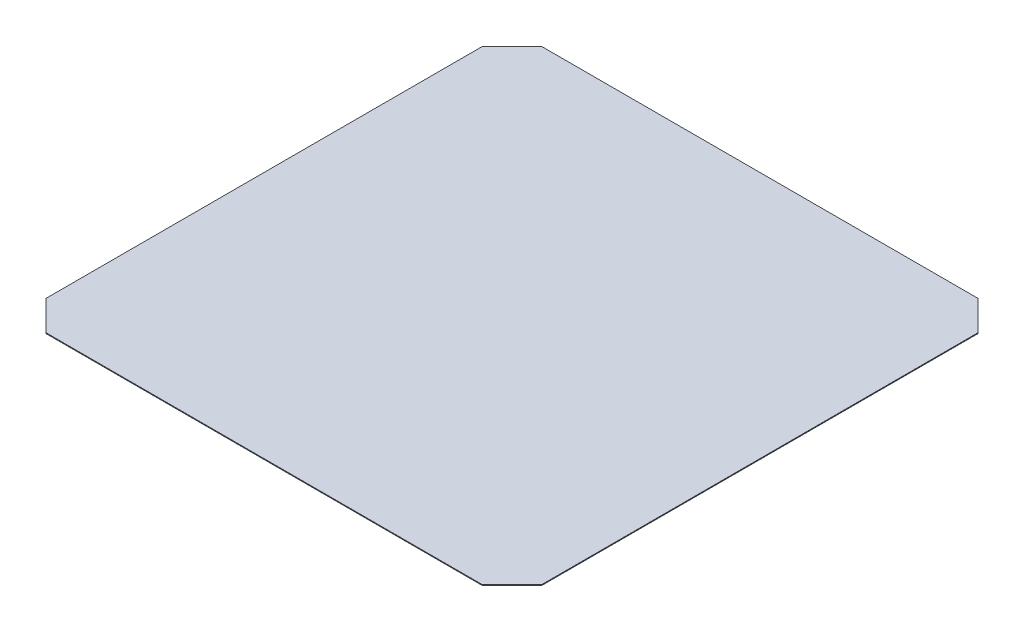
ISO-10303-21;
HEADER;
FILE_DESCRIPTION(('STEP AP214'),'2;1');
FILE_NAME('part.step','',(''),(''),'','','');
FILE_SCHEMA(('AUTOMOTIVE_DESIGN { 1 0 10303 214 1 1 1 1 }'));
ENDSEC;
DATA;
#1=APPLICATION_CONTEXT('core data for automotive mechanical design processes');
#2=APPLICATION_PROTOCOL_DEFINITION('international standard','automotive_design',2000,#1);
#3=PRODUCT_CONTEXT('',#1,'mechanical');
#4=PRODUCT('Part','Part','',(#3));
#5=PRODUCT_RELATED_PRODUCT_CATEGORY('part','',(#4));
#6=PRODUCT_DEFINITION_FORMATION('','',#4);
#7=PRODUCT_DEFINITION_CONTEXT('part definition',#1,'design');
#8=PRODUCT_DEFINITION('design','',#6,#7);
#9=PRODUCT_DEFINITION_SHAPE('','',#8);
#10=(LENGTH_UNIT() NAMED_UNIT(*) SI_UNIT(.MILLI.,.METRE.));
#11=(NAMED_UNIT(*) PLANE_ANGLE_UNIT() SI_UNIT($,.RADIAN.));
#12=(NAMED_UNIT(*) SI_UNIT($,.STERADIAN.) SOLID_ANGLE_UNIT());
#13=UNCERTAINTY_MEASURE_WITH_UNIT(LENGTH_MEASURE(1.E-05),#10,'distance_accuracy_value','');
#14=(GEOMETRIC_REPRESENTATION_CONTEXT(3) GLOBAL_UNCERTAINTY_ASSIGNED_CONTEXT((#13)) GLOBAL_UNIT_ASSIGNED_CONTEXT((#10,
#11,#12)) REPRESENTATION_CONTEXT('',''));
#15=CARTESIAN_POINT('',(0.,0.,0.));
#16=DIRECTION('',(0.,0.,1.));
#17=DIRECTION('',(1.,0.,0.));
#18=AXIS2_PLACEMENT_3D('',#15,#16,#17);
#19=CARTESIAN_POINT('',(-55.,0.2,62.5000000000001));
#20=DIRECTION('',(0.707106781186545,0.,-0.70710678118655));
#21=DIRECTION('',(-0.70710678118655,0.,-0.707106781186545));
#22=AXIS2_PLACEMENT_3D('',#19,#20,#21);
#23=PLANE('',#22);
#24=DIRECTION('',(0.70710678118655,0.,0.707106781186545));
#25=VECTOR('',#24,1.);
#26=CARTESIAN_POINT('',(-55.,0.,62.5000000000001));
#27=LINE('',#26,#25);
#28=CARTESIAN_POINT('',(-62.5,0.,55.0000000000001));
#29=VERTEX_POINT('',#28);
#30=CARTESIAN_POINT('',(-55.,0.,62.5000000000001));
#31=VERTEX_POINT('',#30);
#32=EDGE_CURVE('E135',#29,#31,#27,.T.);
#33=ORIENTED_EDGE('',*,*,#32,.T.);
#34=DIRECTION('',(0.,-1.,0.));
#35=VECTOR('',#34,1.);
#36=CARTESIAN_POINT('',(-55.,0.2,62.5000000000001));
#37=LINE('',#36,#35);
#38=CARTESIAN_POINT('',(-55.,0.2,62.5000000000001));
#39=VERTEX_POINT('',#38);
#40=EDGE_CURVE('E43',#39,#31,#37,.T.);
#41=ORIENTED_EDGE('',*,*,#40,.F.);
#42=DIRECTION('',(0.70710678118655,0.,0.707106781186545));
#43=VECTOR('',#42,1.);
#44=CARTESIAN_POINT('',(-55.,0.2,62.5000000000001));
#45=LINE('',#44,#43);
#46=CARTESIAN_POINT('',(-62.5,0.2,55.0000000000001));
#47=VERTEX_POINT('',#46);
#48=EDGE_CURVE('E95',#47,#39,#45,.T.);
#49=ORIENTED_EDGE('',*,*,#48,.F.);
#50=DIRECTION('',(0.,-1.,0.));
#51=VECTOR('',#50,1.);
#52=CARTESIAN_POINT('',(-62.5,0.2,55.0000000000001));
#53=LINE('',#52,#51);
#54=EDGE_CURVE('E11',#47,#29,#53,.T.);
#55=ORIENTED_EDGE('',*,*,#54,.T.);
#56=EDGE_LOOP('',(#33,#41,#49,#55));
#57=FACE_BOUND('',#56,.T.);
#58=ADVANCED_FACE('F35',(#57),#23,.F.);
#59=CARTESIAN_POINT('',(55.,0.2,62.5000000000001));
#60=DIRECTION('',(0.,0.,-1.));
#61=DIRECTION('',(-1.,0.,0.));
#62=AXIS2_PLACEMENT_3D('',#59,#60,#61);
#63=PLANE('',#62);
#64=DIRECTION('',(1.,0.,0.));
#65=VECTOR('',#64,1.);
#66=CARTESIAN_POINT('',(55.,0.,62.5000000000001));
#67=LINE('',#66,#65);
#68=CARTESIAN_POINT('',(55.,0.,62.5000000000001));
#69=VERTEX_POINT('',#68);
#70=EDGE_CURVE('E137',#31,#69,#67,.T.);
#71=ORIENTED_EDGE('',*,*,#70,.T.);
#72=DIRECTION('',(0.,-1.,0.));
#73=VECTOR('',#72,1.);
#74=CARTESIAN_POINT('',(55.,0.2,62.5000000000001));
#75=LINE('',#74,#73);
#76=CARTESIAN_POINT('',(55.,0.2,62.5000000000001));
#77=VERTEX_POINT('',#76);
#78=EDGE_CURVE('E154',#77,#69,#75,.T.);
#79=ORIENTED_EDGE('',*,*,#78,.F.);
#80=DIRECTION('',(1.,0.,0.));
#81=VECTOR('',#80,1.);
#82=CARTESIAN_POINT('',(55.,0.2,62.5000000000001));
#83=LINE('',#82,#81);
#84=EDGE_CURVE('E162',#39,#77,#83,.T.);
#85=ORIENTED_EDGE('',*,*,#84,.F.);
#86=ORIENTED_EDGE('',*,*,#40,.T.);
#87=EDGE_LOOP('',(#71,#79,#85,#86));
#88=FACE_BOUND('',#87,.T.);
#89=ADVANCED_FACE('F160',(#88),#63,.F.);
#90=CARTESIAN_POINT('',(62.5,0.2,55.0000000000001));
#91=DIRECTION('',(-0.707106781186548,0.,-0.707106781186547));
#92=DIRECTION('',(-0.707106781186547,0.,0.707106781186548));
#93=AXIS2_PLACEMENT_3D('',#90,#91,#92);
#94=PLANE('',#93);
#95=DIRECTION('',(0.707106781186547,0.,-0.707106781186548));
#96=VECTOR('',#95,1.);
#97=CARTESIAN_POINT('',(62.5,0.,55.0000000000001));
#98=LINE('',#97,#96);
#99=CARTESIAN_POINT('',(62.5,0.,55.0000000000001));
#100=VERTEX_POINT('',#99);
#101=EDGE_CURVE('E139',#69,#100,#98,.T.);
#102=ORIENTED_EDGE('',*,*,#101,.T.);
#103=DIRECTION('',(0.,-1.,0.));
#104=VECTOR('',#103,1.);
#105=CARTESIAN_POINT('',(62.5,0.2,55.0000000000001));
#106=LINE('',#105,#104);
#107=CARTESIAN_POINT('',(62.5,0.2,55.0000000000001));
#108=VERTEX_POINT('',#107);
#109=EDGE_CURVE('E151',#108,#100,#106,.T.);
#110=ORIENTED_EDGE('',*,*,#109,.F.);
#111=DIRECTION('',(0.707106781186547,0.,-0.707106781186548));
#112=VECTOR('',#111,1.);
#113=CARTESIAN_POINT('',(62.5,0.2,55.0000000000001));
#114=LINE('',#113,#112);
#115=EDGE_CURVE('E175',#77,#108,#114,.T.);
#116=ORIENTED_EDGE('',*,*,#115,.F.);
#117=ORIENTED_EDGE('',*,*,#78,.T.);
#118=EDGE_LOOP('',(#102,#110,#116,#117));
#119=FACE_BOUND('',#118,.T.);
#120=ADVANCED_FACE('F171',(#119),#94,.F.);
#121=CARTESIAN_POINT('',(62.5,0.2,-55.0000000000001));
#122=DIRECTION('',(-1.,0.,0.));
#123=DIRECTION('',(0.,0.,1.));
#124=AXIS2_PLACEMENT_3D('',#121,#122,#123);
#125=PLANE('',#124);
#126=DIRECTION('',(0.,0.,-1.));
#127=VECTOR('',#126,1.);
#128=CARTESIAN_POINT('',(62.5,0.,-55.0000000000001));
#129=LINE('',#128,#127);
#130=CARTESIAN_POINT('',(62.5,0.,-55.0000000000001));
#131=VERTEX_POINT('',#130);
#132=EDGE_CURVE('E141',#100,#131,#129,.T.);
#133=ORIENTED_EDGE('',*,*,#132,.T.);
#134=DIRECTION('',(0.,-1.,0.));
#135=VECTOR('',#134,1.);
#136=CARTESIAN_POINT('',(62.5,0.2,-55.0000000000001));
#137=LINE('',#136,#135);
#138=CARTESIAN_POINT('',(62.5,0.2,-55.0000000000001));
#139=VERTEX_POINT('',#138);
#140=EDGE_CURVE('E124',#139,#131,#137,.T.);
#141=ORIENTED_EDGE('',*,*,#140,.F.);
#142=DIRECTION('',(0.,0.,-1.));
#143=VECTOR('',#142,1.);
#144=CARTESIAN_POINT('',(62.5,0.2,-55.0000000000001));
#145=LINE('',#144,#143);
#146=EDGE_CURVE('E115',#108,#139,#145,.T.);
#147=ORIENTED_EDGE('',*,*,#146,.F.);
#148=ORIENTED_EDGE('',*,*,#109,.T.);
#149=EDGE_LOOP('',(#133,#141,#147,#148));
#150=FACE_BOUND('',#149,.T.);
#151=ADVANCED_FACE('F174',(#150),#125,.F.);
#152=CARTESIAN_POINT('',(55.,0.2,-62.5000000000001));
#153=DIRECTION('',(-0.707106781186547,0.,0.707106781186548));
#154=DIRECTION('',(0.707106781186548,0.,0.707106781186547));
#155=AXIS2_PLACEMENT_3D('',#152,#153,#154);
#156=PLANE('',#155);
#157=DIRECTION('',(-0.707106781186548,0.,-0.707106781186547));
#158=VECTOR('',#157,1.);
#159=CARTESIAN_POINT('',(55.,0.,-62.5000000000001));
#160=LINE('',#159,#158);
#161=CARTESIAN_POINT('',(55.,0.,-62.5000000000001));
#162=VERTEX_POINT('',#161);
#163=EDGE_CURVE('E123',#131,#162,#160,.T.);
#164=ORIENTED_EDGE('',*,*,#163,.T.);
#165=DIRECTION('',(0.,-1.,0.));
#166=VECTOR('',#165,1.);
#167=CARTESIAN_POINT('',(55.,0.2,-62.5000000000001));
#168=LINE('',#167,#166);
#169=CARTESIAN_POINT('',(55.,0.2,-62.5000000000001));
#170=VERTEX_POINT('',#169);
#171=EDGE_CURVE('E120',#170,#162,#168,.T.);
#172=ORIENTED_EDGE('',*,*,#171,.F.);
#173=DIRECTION('',(-0.707106781186548,0.,-0.707106781186547));
#174=VECTOR('',#173,1.);
#175=CARTESIAN_POINT('',(55.,0.2,-62.5000000000001));
#176=LINE('',#175,#174);
#177=EDGE_CURVE('E109',#139,#170,#176,.T.);
#178=ORIENTED_EDGE('',*,*,#177,.F.);
#179=ORIENTED_EDGE('',*,*,#140,.T.);
#180=EDGE_LOOP('',(#164,#172,#178,#179));
#181=FACE_BOUND('',#180,.T.);
#182=ADVANCED_FACE('F121',(#181),#156,.F.);
#183=CARTESIAN_POINT('',(-55.,0.2,-62.5000000000001));
#184=DIRECTION('',(0.,0.,1.));
#185=DIRECTION('',(1.,0.,0.));
#186=AXIS2_PLACEMENT_3D('',#183,#184,#185);
#187=PLANE('',#186);
#188=DIRECTION('',(-1.,0.,0.));
#189=VECTOR('',#188,1.);
#190=CARTESIAN_POINT('',(-55.,0.,-62.5000000000001));
#191=LINE('',#190,#189);
#192=CARTESIAN_POINT('',(-55.,0.,-62.5000000000001));
#193=VERTEX_POINT('',#192);
#194=EDGE_CURVE('E81',#162,#193,#191,.T.);
#195=ORIENTED_EDGE('',*,*,#194,.T.);
#196=DIRECTION('',(0.,-1.,0.));
#197=VECTOR('',#196,1.);
#198=CARTESIAN_POINT('',(-55.,0.2,-62.5000000000001));
#199=LINE('',#198,#197);
#200=CARTESIAN_POINT('',(-55.,0.2,-62.5000000000001));
#201=VERTEX_POINT('',#200);
#202=EDGE_CURVE('E125',#201,#193,#199,.T.);
#203=ORIENTED_EDGE('',*,*,#202,.F.);
#204=DIRECTION('',(-1.,0.,0.));
#205=VECTOR('',#204,1.);
#206=CARTESIAN_POINT('',(-55.,0.2,-62.5000000000001));
#207=LINE('',#206,#205);
#208=EDGE_CURVE('E113',#170,#201,#207,.T.);
#209=ORIENTED_EDGE('',*,*,#208,.F.);
#210=ORIENTED_EDGE('',*,*,#171,.T.);
#211=EDGE_LOOP('',(#195,#203,#209,#210));
#212=FACE_BOUND('',#211,.T.);
#213=ADVANCED_FACE('F127',(#212),#187,.F.);
#214=CARTESIAN_POINT('',(-62.5,0.2,-55.0000000000001));
#215=DIRECTION('',(0.707106781186546,0.,0.707106781186549));
#216=DIRECTION('',(0.707106781186549,0.,-0.707106781186546));
#217=AXIS2_PLACEMENT_3D('',#214,#215,#216);
#218=PLANE('',#217);
#219=DIRECTION('',(-0.707106781186549,0.,0.707106781186546));
#220=VECTOR('',#219,1.);
#221=CARTESIAN_POINT('',(-62.5,0.,-55.0000000000001));
#222=LINE('',#221,#220);
#223=CARTESIAN_POINT('',(-62.5,0.,-55.0000000000001));
#224=VERTEX_POINT('',#223);
#225=EDGE_CURVE('E88',#193,#224,#222,.T.);
#226=ORIENTED_EDGE('',*,*,#225,.T.);
#227=DIRECTION('',(0.,-1.,0.));
#228=VECTOR('',#227,1.);
#229=CARTESIAN_POINT('',(-62.5,0.2,-55.0000000000001));
#230=LINE('',#229,#228);
#231=CARTESIAN_POINT('',(-62.5,0.2,-55.0000000000001));
#232=VERTEX_POINT('',#231);
#233=EDGE_CURVE('E131',#232,#224,#230,.T.);
#234=ORIENTED_EDGE('',*,*,#233,.F.);
#235=DIRECTION('',(-0.707106781186549,0.,0.707106781186546));
#236=VECTOR('',#235,1.);
#237=CARTESIAN_POINT('',(-62.5,0.2,-55.0000000000001));
#238=LINE('',#237,#236);
#239=EDGE_CURVE('E129',#201,#232,#238,.T.);
#240=ORIENTED_EDGE('',*,*,#239,.F.);
#241=ORIENTED_EDGE('',*,*,#202,.T.);
#242=EDGE_LOOP('',(#226,#234,#240,#241));
#243=FACE_BOUND('',#242,.T.);
#244=ADVANCED_FACE('F196',(#243),#218,.F.);
#245=CARTESIAN_POINT('',(-62.5000000000001,0.2,0.));
#246=DIRECTION('',(1.,0.,0.));
#247=DIRECTION('',(0.,0.,-1.));
#248=AXIS2_PLACEMENT_3D('',#245,#246,#247);
#249=PLANE('',#248);
#250=DIRECTION('',(0.,0.,1.));
#251=VECTOR('',#250,1.);
#252=CARTESIAN_POINT('',(-62.5000000000001,0.,0.));
#253=LINE('',#252,#251);
#254=EDGE_CURVE('E146',#224,#29,#253,.T.);
#255=ORIENTED_EDGE('',*,*,#254,.T.);
#256=ORIENTED_EDGE('',*,*,#54,.F.);
#257=DIRECTION('',(0.,0.,1.));
#258=VECTOR('',#257,1.);
#259=CARTESIAN_POINT('',(-62.5,0.2,55.0000000000001));
#260=LINE('',#259,#258);
#261=EDGE_CURVE('E51',#232,#47,#260,.T.);
#262=ORIENTED_EDGE('',*,*,#261,.F.);
#263=ORIENTED_EDGE('',*,*,#233,.T.);
#264=EDGE_LOOP('',(#255,#256,#262,#263));
#265=FACE_BOUND('',#264,.T.);
#266=ADVANCED_FACE('F180',(#265),#249,.F.);
#267=CARTESIAN_POINT('',(0.,0.2,0.));
#268=DIRECTION('',(0.,-1.,0.));
#269=DIRECTION('',(0.,0.,-1.));
#270=AXIS2_PLACEMENT_3D('',#267,#268,#269);
#271=PLANE('',#270);
#272=ORIENTED_EDGE('',*,*,#261,.T.);
#273=ORIENTED_EDGE('',*,*,#48,.T.);
#274=ORIENTED_EDGE('',*,*,#84,.T.);
#275=ORIENTED_EDGE('',*,*,#115,.T.);
#276=ORIENTED_EDGE('',*,*,#146,.T.);
#277=ORIENTED_EDGE('',*,*,#177,.T.);
#278=ORIENTED_EDGE('',*,*,#208,.T.);
#279=ORIENTED_EDGE('',*,*,#239,.T.);
#280=EDGE_LOOP('',(#272,#273,#274,#275,#276,#277,#278,#279));
#281=FACE_BOUND('',#280,.T.);
#282=ADVANCED_FACE('F111',(#281),#271,.F.);
#283=CARTESIAN_POINT('',(0.,0.,0.));
#284=DIRECTION('',(0.,-1.,0.));
#285=DIRECTION('',(0.,0.,-1.));
#286=AXIS2_PLACEMENT_3D('',#283,#284,#285);
#287=PLANE('',#286);
#288=ORIENTED_EDGE('',*,*,#32,.F.);
#289=ORIENTED_EDGE('',*,*,#254,.F.);
#290=ORIENTED_EDGE('',*,*,#225,.F.);
#291=ORIENTED_EDGE('',*,*,#194,.F.);
#292=ORIENTED_EDGE('',*,*,#163,.F.);
#293=ORIENTED_EDGE('',*,*,#132,.F.);
#294=ORIENTED_EDGE('',*,*,#101,.F.);
#295=ORIENTED_EDGE('',*,*,#70,.F.);
#296=EDGE_LOOP('',(#288,#289,#290,#291,#292,#293,#294,#295));
#297=FACE_BOUND('',#296,.T.);
#298=ADVANCED_FACE('F166',(#297),#287,.T.);
#299=CLOSED_SHELL('',(#58,#89,#120,#151,#182,#213,#244,#266,#282,#298));
#300=MANIFOLD_SOLID_BREP('B2',#299);
#301=ADVANCED_BREP_SHAPE_REPRESENTATION('',(#18,#300),#14);
#302=SHAPE_DEFINITION_REPRESENTATION(#9,#301);
ENDSEC;
END-ISO-10303-21;
